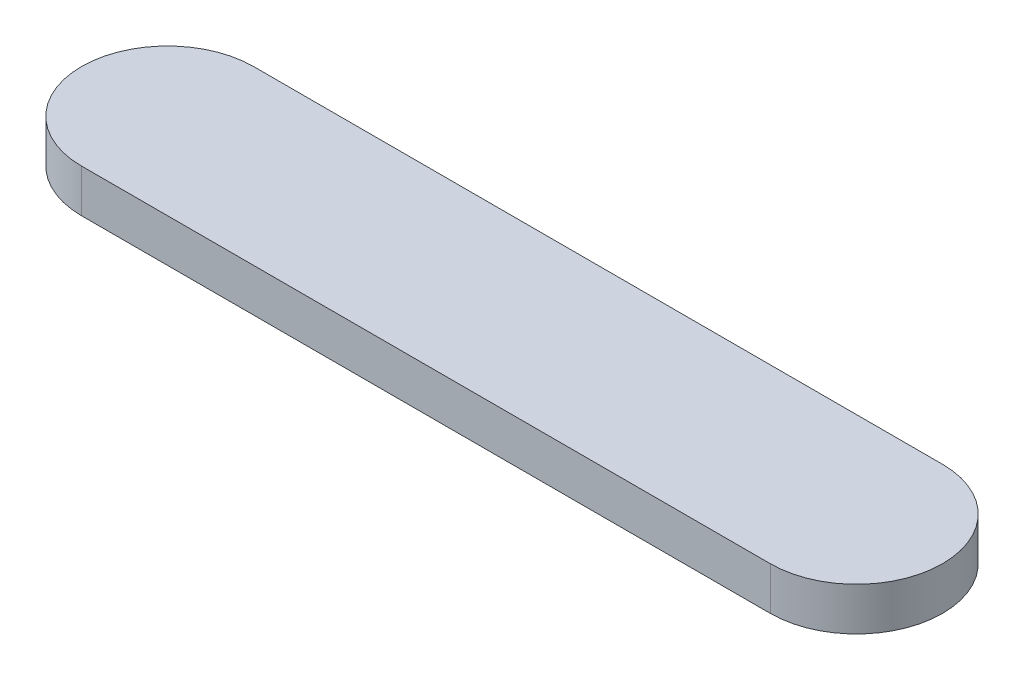
ISO-10303-21;
HEADER;
FILE_DESCRIPTION(('STEP AP214'),'2;1');
FILE_NAME('part.step','',(''),(''),'','','');
FILE_SCHEMA(('AUTOMOTIVE_DESIGN { 1 0 10303 214 1 1 1 1 }'));
ENDSEC;
DATA;
#1=APPLICATION_CONTEXT('core data for automotive mechanical design processes');
#2=APPLICATION_PROTOCOL_DEFINITION('international standard','automotive_design',2000,#1);
#3=PRODUCT_CONTEXT('',#1,'mechanical');
#4=PRODUCT('Part','Part','',(#3));
#5=PRODUCT_RELATED_PRODUCT_CATEGORY('part','',(#4));
#6=PRODUCT_DEFINITION_FORMATION('','',#4);
#7=PRODUCT_DEFINITION_CONTEXT('part definition',#1,'design');
#8=PRODUCT_DEFINITION('design','',#6,#7);
#9=PRODUCT_DEFINITION_SHAPE('','',#8);
#10=(LENGTH_UNIT() NAMED_UNIT(*) SI_UNIT(.MILLI.,.METRE.));
#11=(NAMED_UNIT(*) PLANE_ANGLE_UNIT() SI_UNIT($,.RADIAN.));
#12=(NAMED_UNIT(*) SI_UNIT($,.STERADIAN.) SOLID_ANGLE_UNIT());
#13=UNCERTAINTY_MEASURE_WITH_UNIT(LENGTH_MEASURE(1.E-05),#10,'distance_accuracy_value','');
#14=(GEOMETRIC_REPRESENTATION_CONTEXT(3) GLOBAL_UNCERTAINTY_ASSIGNED_CONTEXT((#13)) GLOBAL_UNIT_ASSIGNED_CONTEXT((#10,
#11,#12)) REPRESENTATION_CONTEXT('',''));
#15=CARTESIAN_POINT('',(0.,0.,0.));
#16=DIRECTION('',(0.,0.,1.));
#17=DIRECTION('',(1.,0.,0.));
#18=AXIS2_PLACEMENT_3D('',#15,#16,#17);
#19=CARTESIAN_POINT('',(-200.,25.,0.));
#20=DIRECTION('',(0.,-1.,0.));
#21=DIRECTION('',(0.,0.,-1.));
#22=AXIS2_PLACEMENT_3D('',#19,#20,#21);
#23=CYLINDRICAL_SURFACE('',#22,50.);
#24=CARTESIAN_POINT('',(-200.,0.,0.));
#25=DIRECTION('',(0.,1.,0.));
#26=DIRECTION('',(0.,0.,1.));
#27=AXIS2_PLACEMENT_3D('',#24,#25,#26);
#28=CIRCLE('',#27,50.);
#29=CARTESIAN_POINT('',(-200.,0.,-50.));
#30=VERTEX_POINT('',#29);
#31=CARTESIAN_POINT('',(-200.,0.,50.));
#32=VERTEX_POINT('',#31);
#33=EDGE_CURVE('E98',#30,#32,#28,.T.);
#34=ORIENTED_EDGE('',*,*,#33,.T.);
#35=DIRECTION('',(0.,-1.,0.));
#36=VECTOR('',#35,1.);
#37=CARTESIAN_POINT('',(-200.,25.,50.));
#38=LINE('',#37,#36);
#39=CARTESIAN_POINT('',(-200.,25.,50.));
#40=VERTEX_POINT('',#39);
#41=EDGE_CURVE('E11',#40,#32,#38,.T.);
#42=ORIENTED_EDGE('',*,*,#41,.F.);
#43=CARTESIAN_POINT('',(-200.,25.,0.));
#44=DIRECTION('',(0.,1.,0.));
#45=DIRECTION('',(0.,0.,1.));
#46=AXIS2_PLACEMENT_3D('',#43,#44,#45);
#47=CIRCLE('',#46,50.);
#48=CARTESIAN_POINT('',(-200.,25.,-50.));
#49=VERTEX_POINT('',#48);
#50=EDGE_CURVE('E86',#49,#40,#47,.T.);
#51=ORIENTED_EDGE('',*,*,#50,.F.);
#52=DIRECTION('',(0.,-1.,0.));
#53=VECTOR('',#52,1.);
#54=CARTESIAN_POINT('',(-200.,25.,-50.));
#55=LINE('',#54,#53);
#56=EDGE_CURVE('E94',#49,#30,#55,.T.);
#57=ORIENTED_EDGE('',*,*,#56,.T.);
#58=EDGE_LOOP('',(#34,#42,#51,#57));
#59=FACE_BOUND('',#58,.T.);
#60=ADVANCED_FACE('F35',(#59),#23,.T.);
#61=CARTESIAN_POINT('',(-200.,25.,50.));
#62=DIRECTION('',(0.,0.,-1.));
#63=DIRECTION('',(-1.,0.,0.));
#64=AXIS2_PLACEMENT_3D('',#61,#62,#63);
#65=PLANE('',#64);
#66=DIRECTION('',(1.,0.,0.));
#67=VECTOR('',#66,1.);
#68=CARTESIAN_POINT('',(-200.,0.,50.));
#69=LINE('',#68,#67);
#70=CARTESIAN_POINT('',(200.,0.,49.9999999999999));
#71=VERTEX_POINT('',#70);
#72=EDGE_CURVE('E90',#32,#71,#69,.T.);
#73=ORIENTED_EDGE('',*,*,#72,.T.);
#74=DIRECTION('',(0.,-1.,0.));
#75=VECTOR('',#74,1.);
#76=CARTESIAN_POINT('',(200.,25.,49.9999999999999));
#77=LINE('',#76,#75);
#78=CARTESIAN_POINT('',(200.,25.,49.9999999999999));
#79=VERTEX_POINT('',#78);
#80=EDGE_CURVE('E43',#79,#71,#77,.T.);
#81=ORIENTED_EDGE('',*,*,#80,.F.);
#82=DIRECTION('',(1.,0.,0.));
#83=VECTOR('',#82,1.);
#84=CARTESIAN_POINT('',(-200.,25.,50.));
#85=LINE('',#84,#83);
#86=EDGE_CURVE('E81',#40,#79,#85,.T.);
#87=ORIENTED_EDGE('',*,*,#86,.F.);
#88=ORIENTED_EDGE('',*,*,#41,.T.);
#89=EDGE_LOOP('',(#73,#81,#87,#88));
#90=FACE_BOUND('',#89,.T.);
#91=ADVANCED_FACE('F89',(#90),#65,.F.);
#92=CARTESIAN_POINT('',(200.,25.,0.));
#93=DIRECTION('',(0.,-1.,0.));
#94=DIRECTION('',(0.,0.,-1.));
#95=AXIS2_PLACEMENT_3D('',#92,#93,#94);
#96=CYLINDRICAL_SURFACE('',#95,50.);
#97=CARTESIAN_POINT('',(200.,0.,0.));
#98=DIRECTION('',(0.,1.,0.));
#99=DIRECTION('',(0.,0.,1.));
#100=AXIS2_PLACEMENT_3D('',#97,#98,#99);
#101=CIRCLE('',#100,50.);
#102=CARTESIAN_POINT('',(200.,0.,-50.0000000000001));
#103=VERTEX_POINT('',#102);
#104=EDGE_CURVE('E68',#71,#103,#101,.T.);
#105=ORIENTED_EDGE('',*,*,#104,.T.);
#106=DIRECTION('',(0.,-1.,0.));
#107=VECTOR('',#106,1.);
#108=CARTESIAN_POINT('',(200.,25.,-50.0000000000001));
#109=LINE('',#108,#107);
#110=CARTESIAN_POINT('',(200.,25.,-50.0000000000001));
#111=VERTEX_POINT('',#110);
#112=EDGE_CURVE('E91',#111,#103,#109,.T.);
#113=ORIENTED_EDGE('',*,*,#112,.F.);
#114=CARTESIAN_POINT('',(200.,25.,0.));
#115=DIRECTION('',(0.,1.,0.));
#116=DIRECTION('',(0.,0.,1.));
#117=AXIS2_PLACEMENT_3D('',#114,#115,#116);
#118=CIRCLE('',#117,50.);
#119=EDGE_CURVE('E84',#79,#111,#118,.T.);
#120=ORIENTED_EDGE('',*,*,#119,.F.);
#121=ORIENTED_EDGE('',*,*,#80,.T.);
#122=EDGE_LOOP('',(#105,#113,#120,#121));
#123=FACE_BOUND('',#122,.T.);
#124=ADVANCED_FACE('F92',(#123),#96,.T.);
#125=CARTESIAN_POINT('',(-200.,25.,-50.));
#126=DIRECTION('',(0.,0.,1.));
#127=DIRECTION('',(1.,0.,0.));
#128=AXIS2_PLACEMENT_3D('',#125,#126,#127);
#129=PLANE('',#128);
#130=DIRECTION('',(-1.,0.,0.));
#131=VECTOR('',#130,1.);
#132=CARTESIAN_POINT('',(-200.,0.,-50.));
#133=LINE('',#132,#131);
#134=EDGE_CURVE('E74',#103,#30,#133,.T.);
#135=ORIENTED_EDGE('',*,*,#134,.T.);
#136=ORIENTED_EDGE('',*,*,#56,.F.);
#137=DIRECTION('',(-1.,0.,0.));
#138=VECTOR('',#137,1.);
#139=CARTESIAN_POINT('',(-200.,25.,-50.));
#140=LINE('',#139,#138);
#141=EDGE_CURVE('E51',#111,#49,#140,.T.);
#142=ORIENTED_EDGE('',*,*,#141,.F.);
#143=ORIENTED_EDGE('',*,*,#112,.T.);
#144=EDGE_LOOP('',(#135,#136,#142,#143));
#145=FACE_BOUND('',#144,.T.);
#146=ADVANCED_FACE('F105',(#145),#129,.F.);
#147=CARTESIAN_POINT('',(-200.,25.,0.));
#148=DIRECTION('',(0.,1.,0.));
#149=DIRECTION('',(0.,0.,1.));
#150=AXIS2_PLACEMENT_3D('',#147,#148,#149);
#151=PLANE('',#150);
#152=ORIENTED_EDGE('',*,*,#50,.T.);
#153=ORIENTED_EDGE('',*,*,#86,.T.);
#154=ORIENTED_EDGE('',*,*,#119,.T.);
#155=ORIENTED_EDGE('',*,*,#141,.T.);
#156=EDGE_LOOP('',(#152,#153,#154,#155));
#157=FACE_BOUND('',#156,.T.);
#158=ADVANCED_FACE('F82',(#157),#151,.T.);
#159=CARTESIAN_POINT('',(-200.,0.,0.));
#160=DIRECTION('',(0.,1.,0.));
#161=DIRECTION('',(0.,0.,1.));
#162=AXIS2_PLACEMENT_3D('',#159,#160,#161);
#163=PLANE('',#162);
#164=ORIENTED_EDGE('',*,*,#33,.F.);
#165=ORIENTED_EDGE('',*,*,#134,.F.);
#166=ORIENTED_EDGE('',*,*,#104,.F.);
#167=ORIENTED_EDGE('',*,*,#72,.F.);
#168=EDGE_LOOP('',(#164,#165,#166,#167));
#169=FACE_BOUND('',#168,.T.);
#170=ADVANCED_FACE('F108',(#169),#163,.F.);
#171=CLOSED_SHELL('',(#60,#91,#124,#146,#158,#170));
#172=MANIFOLD_SOLID_BREP('B2',#171);
#173=ADVANCED_BREP_SHAPE_REPRESENTATION('',(#18,#172),#14);
#174=SHAPE_DEFINITION_REPRESENTATION(#9,#173);
ENDSEC;
END-ISO-10303-21;
